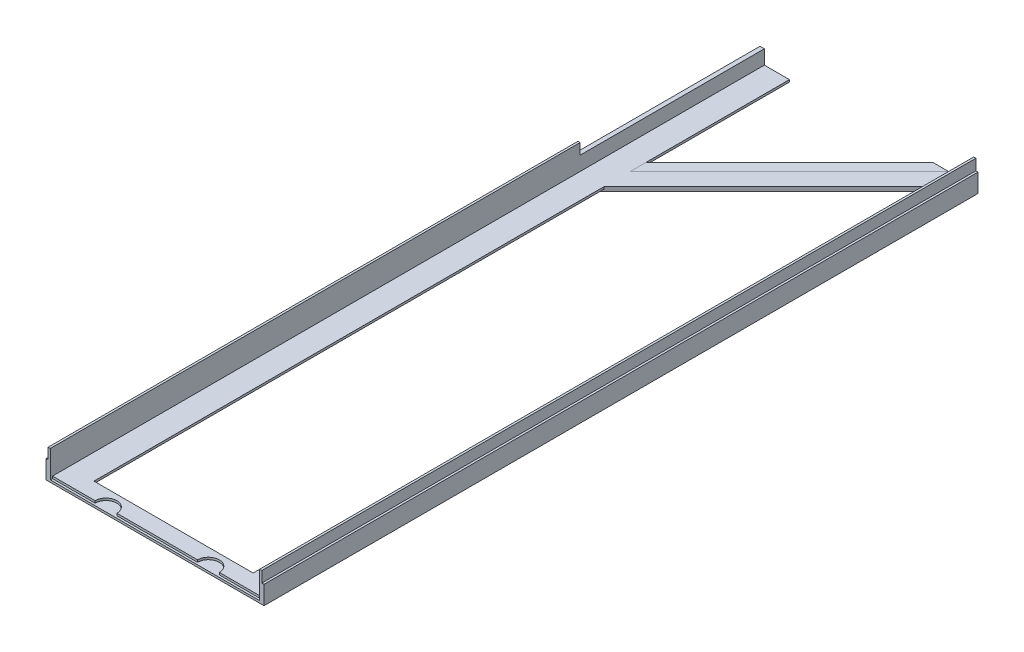
ISO-10303-21;
HEADER;
FILE_DESCRIPTION(('STEP AP214'),'2;1');
FILE_NAME('part.step','',(''),(''),'','','');
FILE_SCHEMA(('AUTOMOTIVE_DESIGN { 1 0 10303 214 1 1 1 1 }'));
ENDSEC;
DATA;
#1=APPLICATION_CONTEXT('core data for automotive mechanical design processes');
#2=APPLICATION_PROTOCOL_DEFINITION('international standard','automotive_design',2000,#1);
#3=PRODUCT_CONTEXT('',#1,'mechanical');
#4=PRODUCT('Part','Part','',(#3));
#5=PRODUCT_RELATED_PRODUCT_CATEGORY('part','',(#4));
#6=PRODUCT_DEFINITION_FORMATION('','',#4);
#7=PRODUCT_DEFINITION_CONTEXT('part definition',#1,'design');
#8=PRODUCT_DEFINITION('design','',#6,#7);
#9=PRODUCT_DEFINITION_SHAPE('','',#8);
#10=(LENGTH_UNIT() NAMED_UNIT(*) SI_UNIT(.MILLI.,.METRE.));
#11=(NAMED_UNIT(*) PLANE_ANGLE_UNIT() SI_UNIT($,.RADIAN.));
#12=(NAMED_UNIT(*) SI_UNIT($,.STERADIAN.) SOLID_ANGLE_UNIT());
#13=UNCERTAINTY_MEASURE_WITH_UNIT(LENGTH_MEASURE(1.E-05),#10,'distance_accuracy_value','');
#14=(GEOMETRIC_REPRESENTATION_CONTEXT(3) GLOBAL_UNCERTAINTY_ASSIGNED_CONTEXT((#13)) GLOBAL_UNIT_ASSIGNED_CONTEXT((#10,
#11,#12)) REPRESENTATION_CONTEXT('',''));
#15=CARTESIAN_POINT('',(0.,0.,0.));
#16=DIRECTION('',(0.,0.,1.));
#17=DIRECTION('',(1.,0.,0.));
#18=AXIS2_PLACEMENT_3D('',#15,#16,#17);
#19=CARTESIAN_POINT('',(13.5,1.,73.0000000000008));
#20=DIRECTION('',(-1.,0.,0.));
#21=DIRECTION('',(0.,-1.,0.));
#22=AXIS2_PLACEMENT_3D('',#19,#20,#21);
#23=PLANE('',#22);
#24=DIRECTION('',(0.,0.,1.));
#25=VECTOR('',#24,1.);
#26=CARTESIAN_POINT('',(13.5,2.,73.0000000000008));
#27=LINE('',#26,#25);
#28=CARTESIAN_POINT('',(13.5,2.,65.9289321881353));
#29=VERTEX_POINT('',#28);
#30=CARTESIAN_POINT('',(13.5,2.,73.0000000000008));
#31=VERTEX_POINT('',#30);
#32=EDGE_CURVE('E153',#29,#31,#27,.T.);
#33=ORIENTED_EDGE('',*,*,#32,.F.);
#34=DIRECTION('',(0.,1.,0.));
#35=VECTOR('',#34,1.);
#36=CARTESIAN_POINT('',(13.5,1.,65.9289321881353));
#37=LINE('',#36,#35);
#38=CARTESIAN_POINT('',(13.5,1.,65.9289321881353));
#39=VERTEX_POINT('',#38);
#40=EDGE_CURVE('E13',#39,#29,#37,.T.);
#41=ORIENTED_EDGE('',*,*,#40,.F.);
#42=DIRECTION('',(0.,0.,1.));
#43=VECTOR('',#42,1.);
#44=CARTESIAN_POINT('',(13.5,1.,73.0000000000008));
#45=LINE('',#44,#43);
#46=CARTESIAN_POINT('',(13.5,1.,73.0000000000008));
#47=VERTEX_POINT('',#46);
#48=EDGE_CURVE('E147',#39,#47,#45,.T.);
#49=ORIENTED_EDGE('',*,*,#48,.T.);
#50=DIRECTION('',(0.,1.,0.));
#51=VECTOR('',#50,1.);
#52=CARTESIAN_POINT('',(13.5,1.,73.0000000000008));
#53=LINE('',#52,#51);
#54=EDGE_CURVE('E92',#47,#31,#53,.T.);
#55=ORIENTED_EDGE('',*,*,#54,.T.);
#56=EDGE_LOOP('',(#33,#41,#49,#55));
#57=FACE_BOUND('',#56,.T.);
#58=ADVANCED_FACE('F89',(#57),#23,.T.);
#59=CARTESIAN_POINT('',(13.5,1.,65.9289321881353));
#60=DIRECTION('',(-0.707106781186552,0.,-0.707106781186544));
#61=DIRECTION('',(-0.707106781186544,0.,0.707106781186552));
#62=AXIS2_PLACEMENT_3D('',#59,#60,#61);
#63=PLANE('',#62);
#64=DIRECTION('',(-0.707106781186544,0.,0.707106781186551));
#65=VECTOR('',#64,1.);
#66=CARTESIAN_POINT('',(13.5,2.,65.9289321881353));
#67=LINE('',#66,#65);
#68=CARTESIAN_POINT('',(79.4289321881346,2.00000000000001,0.));
#69=VERTEX_POINT('',#68);
#70=EDGE_CURVE('E149',#69,#29,#67,.T.);
#71=ORIENTED_EDGE('',*,*,#70,.F.);
#72=DIRECTION('',(0.,1.,0.));
#73=VECTOR('',#72,1.);
#74=CARTESIAN_POINT('',(79.4289321881346,1.00000000000001,0.));
#75=LINE('',#74,#73);
#76=CARTESIAN_POINT('',(79.4289321881346,1.00000000000001,0.));
#77=VERTEX_POINT('',#76);
#78=EDGE_CURVE('E98',#77,#69,#75,.T.);
#79=ORIENTED_EDGE('',*,*,#78,.F.);
#80=DIRECTION('',(-0.707106781186544,0.,0.707106781186551));
#81=VECTOR('',#80,1.);
#82=CARTESIAN_POINT('',(13.5,1.,65.9289321881353));
#83=LINE('',#82,#81);
#84=EDGE_CURVE('E144',#77,#39,#83,.T.);
#85=ORIENTED_EDGE('',*,*,#84,.T.);
#86=ORIENTED_EDGE('',*,*,#40,.T.);
#87=EDGE_LOOP('',(#71,#79,#85,#86));
#88=FACE_BOUND('',#87,.T.);
#89=ADVANCED_FACE('F163',(#88),#63,.T.);
#90=CARTESIAN_POINT('',(79.4289321881346,1.00000000000001,0.));
#91=DIRECTION('',(0.,0.,-1.));
#92=DIRECTION('',(-1.,0.,0.));
#93=AXIS2_PLACEMENT_3D('',#90,#91,#92);
#94=PLANE('',#93);
#95=DIRECTION('',(-1.,0.,0.));
#96=VECTOR('',#95,1.);
#97=CARTESIAN_POINT('',(79.4289321881346,2.00000000000001,0.));
#98=LINE('',#97,#96);
#99=CARTESIAN_POINT('',(86.5,2.00000000000001,0.));
#100=VERTEX_POINT('',#99);
#101=EDGE_CURVE('E139',#100,#69,#98,.T.);
#102=ORIENTED_EDGE('',*,*,#101,.F.);
#103=DIRECTION('',(0.,1.,0.));
#104=VECTOR('',#103,1.);
#105=CARTESIAN_POINT('',(86.5,1.00000000000001,0.));
#106=LINE('',#105,#104);
#107=CARTESIAN_POINT('',(86.5,1.00000000000001,0.));
#108=VERTEX_POINT('',#107);
#109=EDGE_CURVE('E134',#108,#100,#106,.T.);
#110=ORIENTED_EDGE('',*,*,#109,.F.);
#111=DIRECTION('',(-1.,0.,0.));
#112=VECTOR('',#111,1.);
#113=CARTESIAN_POINT('',(79.4289321881346,1.00000000000001,0.));
#114=LINE('',#113,#112);
#115=EDGE_CURVE('E137',#108,#77,#114,.T.);
#116=ORIENTED_EDGE('',*,*,#115,.T.);
#117=ORIENTED_EDGE('',*,*,#78,.T.);
#118=EDGE_LOOP('',(#102,#110,#116,#117));
#119=FACE_BOUND('',#118,.T.);
#120=ADVANCED_FACE('F136',(#119),#94,.T.);
#121=CARTESIAN_POINT('',(86.5,1.00000000000001,0.));
#122=DIRECTION('',(0.707106781186551,0.,0.707106781186544));
#123=DIRECTION('',(0.707106781186544,0.,-0.707106781186551));
#124=AXIS2_PLACEMENT_3D('',#121,#122,#123);
#125=PLANE('',#124);
#126=DIRECTION('',(0.707106781186544,0.,-0.707106781186551));
#127=VECTOR('',#126,1.);
#128=CARTESIAN_POINT('',(86.5,2.00000000000001,0.));
#129=LINE('',#128,#127);
#130=EDGE_CURVE('E156',#31,#100,#129,.T.);
#131=ORIENTED_EDGE('',*,*,#130,.F.);
#132=ORIENTED_EDGE('',*,*,#54,.F.);
#133=DIRECTION('',(0.707106781186544,0.,-0.707106781186551));
#134=VECTOR('',#133,1.);
#135=CARTESIAN_POINT('',(86.5,1.00000000000001,0.));
#136=LINE('',#135,#134);
#137=EDGE_CURVE('E143',#47,#108,#136,.T.);
#138=ORIENTED_EDGE('',*,*,#137,.T.);
#139=ORIENTED_EDGE('',*,*,#109,.T.);
#140=EDGE_LOOP('',(#131,#132,#138,#139));
#141=FACE_BOUND('',#140,.T.);
#142=ADVANCED_FACE('F146',(#141),#125,.T.);
#143=CARTESIAN_POINT('',(0.,1.,0.));
#144=DIRECTION('',(0.,-1.,0.));
#145=DIRECTION('',(1.,0.,0.));
#146=AXIS2_PLACEMENT_3D('',#143,#144,#145);
#147=PLANE('',#146);
#148=ORIENTED_EDGE('',*,*,#48,.F.);
#149=ORIENTED_EDGE('',*,*,#84,.F.);
#150=ORIENTED_EDGE('',*,*,#115,.F.);
#151=ORIENTED_EDGE('',*,*,#137,.F.);
#152=EDGE_LOOP('',(#148,#149,#150,#151));
#153=FACE_BOUND('',#152,.T.);
#154=ADVANCED_FACE('F142',(#153),#147,.T.);
#155=CARTESIAN_POINT('',(0.,2.,0.));
#156=DIRECTION('',(0.,-1.,0.));
#157=DIRECTION('',(1.,0.,0.));
#158=AXIS2_PLACEMENT_3D('',#155,#156,#157);
#159=PLANE('',#158);
#160=ORIENTED_EDGE('',*,*,#32,.T.);
#161=ORIENTED_EDGE('',*,*,#130,.T.);
#162=ORIENTED_EDGE('',*,*,#101,.T.);
#163=ORIENTED_EDGE('',*,*,#70,.T.);
#164=EDGE_LOOP('',(#160,#161,#162,#163));
#165=FACE_BOUND('',#164,.T.);
#166=ADVANCED_FACE('F162',(#165),#159,.F.);
#167=CLOSED_SHELL('',(#58,#89,#120,#142,#154,#166));
#168=MANIFOLD_SOLID_BREP('B2',#167);
#169=CARTESIAN_POINT('',(2.,2.,327.5));
#170=DIRECTION('',(0.,-1.,0.));
#171=DIRECTION('',(1.,0.,0.));
#172=AXIS2_PLACEMENT_3D('',#169,#170,#171);
#173=PLANE('',#172);
#174=DIRECTION('',(1.,0.,0.));
#175=VECTOR('',#174,1.);
#176=CARTESIAN_POINT('',(100.,2.00000000000001,319.));
#177=LINE('',#176,#175);
#178=CARTESIAN_POINT('',(13.5,2.,319.));
#179=VERTEX_POINT('',#178);
#180=CARTESIAN_POINT('',(86.5,2.00000000000001,319.));
#181=VERTEX_POINT('',#180);
#182=EDGE_CURVE('E241',#179,#181,#177,.T.);
#183=ORIENTED_EDGE('',*,*,#182,.F.);
#184=DIRECTION('',(0.,0.,-1.));
#185=VECTOR('',#184,1.);
#186=CARTESIAN_POINT('',(13.5,2.,327.5));
#187=LINE('',#186,#185);
#188=CARTESIAN_POINT('',(13.5,2.,85.0208152801722));
#189=VERTEX_POINT('',#188);
#190=EDGE_CURVE('E461',#179,#189,#187,.T.);
#191=ORIENTED_EDGE('',*,*,#190,.T.);
#192=DIRECTION('',(0.707106781186544,0.,-0.707106781186551));
#193=VECTOR('',#192,1.);
#194=CARTESIAN_POINT('',(13.5,2.,85.0208152801722));
#195=LINE('',#194,#193);
#196=CARTESIAN_POINT('',(86.5,2.00000000000001,12.0208152801714));
#197=VERTEX_POINT('',#196);
#198=EDGE_CURVE('E688',#189,#197,#195,.T.);
#199=ORIENTED_EDGE('',*,*,#198,.T.);
#200=DIRECTION('',(0.,0.,-1.));
#201=VECTOR('',#200,1.);
#202=CARTESIAN_POINT('',(86.5,2.00000000000001,327.5));
#203=LINE('',#202,#201);
#204=EDGE_CURVE('E669',#181,#197,#203,.T.);
#205=ORIENTED_EDGE('',*,*,#204,.F.);
#206=EDGE_LOOP('',(#183,#191,#199,#205));
#207=FACE_BOUND('',#206,.T.);
#208=DIRECTION('',(1.,0.,0.));
#209=VECTOR('',#208,1.);
#210=CARTESIAN_POINT('',(2.,2.,326.5));
#211=LINE('',#210,#209);
#212=CARTESIAN_POINT('',(2.,2.,326.5));
#213=VERTEX_POINT('',#212);
#214=CARTESIAN_POINT('',(21.5,2.,326.5));
#215=VERTEX_POINT('',#214);
#216=EDGE_CURVE('E560',#213,#215,#211,.T.);
#217=ORIENTED_EDGE('',*,*,#216,.T.);
#218=CARTESIAN_POINT('',(26.5,2.,326.5));
#219=DIRECTION('',(0.,1.,0.));
#220=DIRECTION('',(-1.,0.,0.));
#221=AXIS2_PLACEMENT_3D('',#218,#219,#220);
#222=CIRCLE('',#221,5.);
#223=CARTESIAN_POINT('',(31.5,2.,326.5));
#224=VERTEX_POINT('',#223);
#225=EDGE_CURVE('E579',#224,#215,#222,.T.);
#226=ORIENTED_EDGE('',*,*,#225,.F.);
#227=CARTESIAN_POINT('',(68.5,2.00000000000001,326.5));
#228=VERTEX_POINT('',#227);
#229=EDGE_CURVE('E558',#224,#228,#211,.T.);
#230=ORIENTED_EDGE('',*,*,#229,.T.);
#231=CARTESIAN_POINT('',(73.5,2.00000000000001,326.5));
#232=DIRECTION('',(0.,1.,0.));
#233=DIRECTION('',(-1.,0.,0.));
#234=AXIS2_PLACEMENT_3D('',#231,#232,#233);
#235=CIRCLE('',#234,5.00000000000001);
#236=CARTESIAN_POINT('',(78.5,2.00000000000001,326.5));
#237=VERTEX_POINT('',#236);
#238=EDGE_CURVE('E567',#237,#228,#235,.T.);
#239=ORIENTED_EDGE('',*,*,#238,.F.);
#240=CARTESIAN_POINT('',(98.,2.00000000000001,326.5));
#241=VERTEX_POINT('',#240);
#242=EDGE_CURVE('E555',#237,#241,#211,.T.);
#243=ORIENTED_EDGE('',*,*,#242,.T.);
#244=DIRECTION('',(0.,0.,-1.));
#245=VECTOR('',#244,1.);
#246=CARTESIAN_POINT('',(98.,2.00000000000001,327.5));
#247=LINE('',#246,#245);
#248=CARTESIAN_POINT('',(98.,2.00000000000001,0.));
#249=VERTEX_POINT('',#248);
#250=EDGE_CURVE('E671',#241,#249,#247,.T.);
#251=ORIENTED_EDGE('',*,*,#250,.T.);
#252=DIRECTION('',(-1.,0.,0.));
#253=VECTOR('',#252,1.);
#254=CARTESIAN_POINT('',(86.5,2.00000000000001,0.));
#255=LINE('',#254,#253);
#256=CARTESIAN_POINT('',(86.5,2.00000000000001,0.));
#257=VERTEX_POINT('',#256);
#258=EDGE_CURVE('E658',#249,#257,#255,.T.);
#259=ORIENTED_EDGE('',*,*,#258,.T.);
#260=DIRECTION('',(-0.707106781186544,0.,0.707106781186551));
#261=VECTOR('',#260,1.);
#262=CARTESIAN_POINT('',(86.5,2.00000000000001,0.));
#263=LINE('',#262,#261);
#264=CARTESIAN_POINT('',(13.5,2.,73.0000000000008));
#265=VERTEX_POINT('',#264);
#266=EDGE_CURVE('E685',#257,#265,#263,.T.);
#267=ORIENTED_EDGE('',*,*,#266,.T.);
#268=CARTESIAN_POINT('',(13.5,2.,0.));
#269=VERTEX_POINT('',#268);
#270=EDGE_CURVE('E460',#265,#269,#187,.T.);
#271=ORIENTED_EDGE('',*,*,#270,.T.);
#272=DIRECTION('',(-1.,0.,0.));
#273=VECTOR('',#272,1.);
#274=CARTESIAN_POINT('',(2.,2.,0.));
#275=LINE('',#274,#273);
#276=CARTESIAN_POINT('',(2.,2.,0.));
#277=VERTEX_POINT('',#276);
#278=EDGE_CURVE('E516',#269,#277,#275,.T.);
#279=ORIENTED_EDGE('',*,*,#278,.T.);
#280=DIRECTION('',(0.,0.,-1.));
#281=VECTOR('',#280,1.);
#282=CARTESIAN_POINT('',(2.,2.,327.5));
#283=LINE('',#282,#281);
#284=EDGE_CURVE('E453',#213,#277,#283,.T.);
#285=ORIENTED_EDGE('',*,*,#284,.F.);
#286=EDGE_LOOP('',(#217,#226,#230,#239,#243,#251,#259,#267,#271,#279,#285));
#287=FACE_BOUND('',#286,.T.);
#288=ADVANCED_FACE('F218',(#207,#287),#173,.F.);
#289=CARTESIAN_POINT('',(0.,0.,327.5));
#290=DIRECTION('',(0.,0.,-1.));
#291=DIRECTION('',(-1.,0.,0.));
#292=AXIS2_PLACEMENT_3D('',#289,#290,#291);
#293=PLANE('',#292);
#294=DIRECTION('',(1.,0.,0.));
#295=VECTOR('',#294,1.);
#296=CARTESIAN_POINT('',(0.,1.,327.5));
#297=LINE('',#296,#295);
#298=CARTESIAN_POINT('',(2.,1.,327.5));
#299=VERTEX_POINT('',#298);
#300=CARTESIAN_POINT('',(98.,1.00000000000001,327.5));
#301=VERTEX_POINT('',#300);
#302=EDGE_CURVE('E87',#299,#301,#297,.T.);
#303=ORIENTED_EDGE('',*,*,#302,.F.);
#304=DIRECTION('',(0.,1.,0.));
#305=VECTOR('',#304,1.);
#306=CARTESIAN_POINT('',(2.,13.5,327.5));
#307=LINE('',#306,#305);
#308=CARTESIAN_POINT('',(2.,13.5,327.5));
#309=VERTEX_POINT('',#308);
#310=EDGE_CURVE('E493',#299,#309,#307,.T.);
#311=ORIENTED_EDGE('',*,*,#310,.T.);
#312=DIRECTION('',(-1.,0.,0.));
#313=VECTOR('',#312,1.);
#314=CARTESIAN_POINT('',(1.,13.5,327.5));
#315=LINE('',#314,#313);
#316=CARTESIAN_POINT('',(1.,13.5,327.5));
#317=VERTEX_POINT('',#316);
#318=EDGE_CURVE('E496',#309,#317,#315,.T.);
#319=ORIENTED_EDGE('',*,*,#318,.T.);
#320=DIRECTION('',(0.,-1.,0.));
#321=VECTOR('',#320,1.);
#322=CARTESIAN_POINT('',(1.,8.5,327.5));
#323=LINE('',#322,#321);
#324=CARTESIAN_POINT('',(1.,8.5,327.5));
#325=VERTEX_POINT('',#324);
#326=EDGE_CURVE('E450',#317,#325,#323,.T.);
#327=ORIENTED_EDGE('',*,*,#326,.T.);
#328=DIRECTION('',(-1.,0.,0.));
#329=VECTOR('',#328,1.);
#330=CARTESIAN_POINT('',(0.,8.5,327.5));
#331=LINE('',#330,#329);
#332=CARTESIAN_POINT('',(0.,8.5,327.5));
#333=VERTEX_POINT('',#332);
#334=EDGE_CURVE('E499',#325,#333,#331,.T.);
#335=ORIENTED_EDGE('',*,*,#334,.T.);
#336=DIRECTION('',(0.,-1.,0.));
#337=VECTOR('',#336,1.);
#338=CARTESIAN_POINT('',(0.,0.,327.5));
#339=LINE('',#338,#337);
#340=CARTESIAN_POINT('',(0.,0.,327.5));
#341=VERTEX_POINT('',#340);
#342=EDGE_CURVE('E501',#333,#341,#339,.T.);
#343=ORIENTED_EDGE('',*,*,#342,.T.);
#344=DIRECTION('',(1.,0.,0.));
#345=VECTOR('',#344,1.);
#346=CARTESIAN_POINT('',(8.5,0.,327.5));
#347=LINE('',#346,#345);
#348=CARTESIAN_POINT('',(100.,0.,327.5));
#349=VERTEX_POINT('',#348);
#350=EDGE_CURVE('E491',#341,#349,#347,.T.);
#351=ORIENTED_EDGE('',*,*,#350,.T.);
#352=DIRECTION('',(0.,1.,0.));
#353=VECTOR('',#352,1.);
#354=CARTESIAN_POINT('',(100.,8.50000000000001,327.5));
#355=LINE('',#354,#353);
#356=CARTESIAN_POINT('',(100.,8.50000000000001,327.5));
#357=VERTEX_POINT('',#356);
#358=EDGE_CURVE('E547',#349,#357,#355,.T.);
#359=ORIENTED_EDGE('',*,*,#358,.T.);
#360=DIRECTION('',(-1.,0.,0.));
#361=VECTOR('',#360,1.);
#362=CARTESIAN_POINT('',(99.,8.50000000000001,327.5));
#363=LINE('',#362,#361);
#364=CARTESIAN_POINT('',(99.,8.50000000000001,327.5));
#365=VERTEX_POINT('',#364);
#366=EDGE_CURVE('E637',#357,#365,#363,.T.);
#367=ORIENTED_EDGE('',*,*,#366,.T.);
#368=DIRECTION('',(0.,1.,0.));
#369=VECTOR('',#368,1.);
#370=CARTESIAN_POINT('',(99.,13.5,327.5));
#371=LINE('',#370,#369);
#372=CARTESIAN_POINT('',(99.,13.5,327.5));
#373=VERTEX_POINT('',#372);
#374=EDGE_CURVE('E640',#365,#373,#371,.T.);
#375=ORIENTED_EDGE('',*,*,#374,.T.);
#376=DIRECTION('',(-1.,0.,0.));
#377=VECTOR('',#376,1.);
#378=CARTESIAN_POINT('',(98.,13.5,327.5));
#379=LINE('',#378,#377);
#380=CARTESIAN_POINT('',(98.,13.5,327.5));
#381=VERTEX_POINT('',#380);
#382=EDGE_CURVE('E642',#373,#381,#379,.T.);
#383=ORIENTED_EDGE('',*,*,#382,.T.);
#384=DIRECTION('',(0.,-1.,0.));
#385=VECTOR('',#384,1.);
#386=CARTESIAN_POINT('',(98.,2.00000000000001,327.5));
#387=LINE('',#386,#385);
#388=EDGE_CURVE('E644',#381,#301,#387,.T.);
#389=ORIENTED_EDGE('',*,*,#388,.T.);
#390=EDGE_LOOP('',(#303,#311,#319,#327,#335,#343,#351,#359,#367,#375,#383,#389));
#391=FACE_BOUND('',#390,.T.);
#392=ADVANCED_FACE('F546',(#391),#293,.F.);
#393=CARTESIAN_POINT('',(8.5,1.,327.5));
#394=DIRECTION('',(-1.,0.,0.));
#395=DIRECTION('',(0.,0.,1.));
#396=AXIS2_PLACEMENT_3D('',#393,#394,#395);
#397=PLANE('',#396);
#398=DIRECTION('',(0.,0.,-1.));
#399=VECTOR('',#398,1.);
#400=CARTESIAN_POINT('',(8.5,1.,327.5));
#401=LINE('',#400,#399);
#402=CARTESIAN_POINT('',(8.5,1.,319.));
#403=VERTEX_POINT('',#402);
#404=CARTESIAN_POINT('',(8.5,1.,90.0208152801721));
#405=VERTEX_POINT('',#404);
#406=EDGE_CURVE('E467',#403,#405,#401,.T.);
#407=ORIENTED_EDGE('',*,*,#406,.F.);
#408=DIRECTION('',(0.,-1.,0.));
#409=VECTOR('',#408,1.);
#410=CARTESIAN_POINT('',(8.5,1.,319.));
#411=LINE('',#410,#409);
#412=CARTESIAN_POINT('',(8.50000000000001,0.,319.));
#413=VERTEX_POINT('',#412);
#414=EDGE_CURVE('E615',#403,#413,#411,.T.);
#415=ORIENTED_EDGE('',*,*,#414,.T.);
#416=DIRECTION('',(0.,0.,-1.));
#417=VECTOR('',#416,1.);
#418=CARTESIAN_POINT('',(8.5,0.,327.5));
#419=LINE('',#418,#417);
#420=CARTESIAN_POINT('',(8.5,0.,90.0208152801721));
#421=VERTEX_POINT('',#420);
#422=EDGE_CURVE('E470',#413,#421,#419,.T.);
#423=ORIENTED_EDGE('',*,*,#422,.T.);
#424=DIRECTION('',(0.,1.,0.));
#425=VECTOR('',#424,1.);
#426=CARTESIAN_POINT('',(8.5,0.,90.0208152801721));
#427=LINE('',#426,#425);
#428=EDGE_CURVE('E632',#421,#405,#427,.T.);
#429=ORIENTED_EDGE('',*,*,#428,.T.);
#430=EDGE_LOOP('',(#407,#415,#423,#429));
#431=FACE_BOUND('',#430,.T.);
#432=ADVANCED_FACE('F713',(#431),#397,.F.);
#433=CARTESIAN_POINT('',(13.5,1.,327.5));
#434=DIRECTION('',(0.,1.,0.));
#435=DIRECTION('',(-1.,0.,0.));
#436=AXIS2_PLACEMENT_3D('',#433,#434,#435);
#437=PLANE('',#436);
#438=DIRECTION('',(0.,0.,-1.));
#439=VECTOR('',#438,1.);
#440=CARTESIAN_POINT('',(13.5,1.,327.5));
#441=LINE('',#440,#439);
#442=CARTESIAN_POINT('',(13.5,1.,319.));
#443=VERTEX_POINT('',#442);
#444=CARTESIAN_POINT('',(13.5,1.,85.0208152801722));
#445=VERTEX_POINT('',#444);
#446=EDGE_CURVE('E464',#443,#445,#441,.T.);
#447=ORIENTED_EDGE('',*,*,#446,.F.);
#448=DIRECTION('',(-1.,0.,0.));
#449=VECTOR('',#448,1.);
#450=CARTESIAN_POINT('',(13.5,1.,319.));
#451=LINE('',#450,#449);
#452=EDGE_CURVE('E612',#443,#403,#451,.T.);
#453=ORIENTED_EDGE('',*,*,#452,.T.);
#454=ORIENTED_EDGE('',*,*,#406,.T.);
#455=DIRECTION('',(-0.707106781186549,0.,0.707106781186546));
#456=VECTOR('',#455,1.);
#457=CARTESIAN_POINT('',(49.260407640086,1.00000000000001,49.2604076400863));
#458=LINE('',#457,#456);
#459=EDGE_CURVE('E626',#445,#405,#458,.T.);
#460=ORIENTED_EDGE('',*,*,#459,.F.);
#461=EDGE_LOOP('',(#447,#453,#454,#460));
#462=FACE_BOUND('',#461,.T.);
#463=ADVANCED_FACE('F710',(#462),#437,.F.);
#464=CARTESIAN_POINT('',(13.5,2.,327.5));
#465=DIRECTION('',(-1.,0.,0.));
#466=DIRECTION('',(0.,0.,1.));
#467=AXIS2_PLACEMENT_3D('',#464,#465,#466);
#468=PLANE('',#467);
#469=DIRECTION('',(0.,1.,0.));
#470=VECTOR('',#469,1.);
#471=CARTESIAN_POINT('',(13.5,0.,73.0000000000008));
#472=LINE('',#471,#470);
#473=CARTESIAN_POINT('',(13.5,1.,73.0000000000008));
#474=VERTEX_POINT('',#473);
#475=EDGE_CURVE('E473',#474,#265,#472,.T.);
#476=ORIENTED_EDGE('',*,*,#475,.F.);
#477=CARTESIAN_POINT('',(13.5,1.,0.));
#478=VERTEX_POINT('',#477);
#479=EDGE_CURVE('E463',#474,#478,#441,.T.);
#480=ORIENTED_EDGE('',*,*,#479,.T.);
#481=DIRECTION('',(0.,1.,0.));
#482=VECTOR('',#481,1.);
#483=CARTESIAN_POINT('',(13.5,2.,0.));
#484=LINE('',#483,#482);
#485=EDGE_CURVE('E513',#478,#269,#484,.T.);
#486=ORIENTED_EDGE('',*,*,#485,.T.);
#487=ORIENTED_EDGE('',*,*,#270,.F.);
#488=EDGE_LOOP('',(#476,#480,#486,#487));
#489=FACE_BOUND('',#488,.T.);
#490=ADVANCED_FACE('F750',(#489),#468,.F.);
#491=CARTESIAN_POINT('',(8.5,0.,327.5));
#492=DIRECTION('',(0.,1.,0.));
#493=DIRECTION('',(-1.,0.,0.));
#494=AXIS2_PLACEMENT_3D('',#491,#492,#493);
#495=PLANE('',#494);
#496=ORIENTED_EDGE('',*,*,#422,.F.);
#497=DIRECTION('',(1.,0.,0.));
#498=VECTOR('',#497,1.);
#499=CARTESIAN_POINT('',(100.,0.,319.));
#500=LINE('',#499,#498);
#501=CARTESIAN_POINT('',(91.5,0.,319.));
#502=VERTEX_POINT('',#501);
#503=EDGE_CURVE('E573',#413,#502,#500,.T.);
#504=ORIENTED_EDGE('',*,*,#503,.T.);
#505=DIRECTION('',(0.,0.,-1.));
#506=VECTOR('',#505,1.);
#507=CARTESIAN_POINT('',(91.5,0.,327.5));
#508=LINE('',#507,#506);
#509=CARTESIAN_POINT('',(91.5,0.,7.02081528017151));
#510=VERTEX_POINT('',#509);
#511=EDGE_CURVE('E663',#502,#510,#508,.T.);
#512=ORIENTED_EDGE('',*,*,#511,.T.);
#513=DIRECTION('',(0.707106781186544,0.,-0.707106781186551));
#514=VECTOR('',#513,1.);
#515=CARTESIAN_POINT('',(13.5,0.,85.0208152801722));
#516=LINE('',#515,#514);
#517=EDGE_CURVE('E490',#421,#510,#516,.T.);
#518=ORIENTED_EDGE('',*,*,#517,.F.);
#519=EDGE_LOOP('',(#496,#504,#512,#518));
#520=FACE_BOUND('',#519,.T.);
#521=DIRECTION('',(1.,0.,0.));
#522=VECTOR('',#521,1.);
#523=CARTESIAN_POINT('',(100.,0.,0.));
#524=LINE('',#523,#522);
#525=CARTESIAN_POINT('',(86.5,0.,0.));
#526=VERTEX_POINT('',#525);
#527=CARTESIAN_POINT('',(100.,0.,0.));
#528=VERTEX_POINT('',#527);
#529=EDGE_CURVE('E638',#526,#528,#524,.T.);
#530=ORIENTED_EDGE('',*,*,#529,.T.);
#531=DIRECTION('',(0.,0.,-1.));
#532=VECTOR('',#531,1.);
#533=CARTESIAN_POINT('',(100.,0.,327.5));
#534=LINE('',#533,#532);
#535=EDGE_CURVE('E543',#349,#528,#534,.T.);
#536=ORIENTED_EDGE('',*,*,#535,.F.);
#537=ORIENTED_EDGE('',*,*,#350,.F.);
#538=DIRECTION('',(0.,0.,-1.));
#539=VECTOR('',#538,1.);
#540=CARTESIAN_POINT('',(0.,0.,327.5));
#541=LINE('',#540,#539);
#542=CARTESIAN_POINT('',(0.,0.,0.));
#543=VERTEX_POINT('',#542);
#544=EDGE_CURVE('E503',#341,#543,#541,.T.);
#545=ORIENTED_EDGE('',*,*,#544,.T.);
#546=DIRECTION('',(1.,0.,0.));
#547=VECTOR('',#546,1.);
#548=CARTESIAN_POINT('',(8.5,0.,0.));
#549=LINE('',#548,#547);
#550=CARTESIAN_POINT('',(8.5,0.,0.));
#551=VERTEX_POINT('',#550);
#552=EDGE_CURVE('E504',#543,#551,#549,.T.);
#553=ORIENTED_EDGE('',*,*,#552,.T.);
#554=CARTESIAN_POINT('',(8.5,0.,78.0000000000007));
#555=VERTEX_POINT('',#554);
#556=EDGE_CURVE('E469',#555,#551,#419,.T.);
#557=ORIENTED_EDGE('',*,*,#556,.F.);
#558=DIRECTION('',(-0.707106781186544,0.,0.707106781186551));
#559=VECTOR('',#558,1.);
#560=CARTESIAN_POINT('',(86.5,0.,0.));
#561=LINE('',#560,#559);
#562=EDGE_CURVE('E686',#526,#555,#561,.T.);
#563=ORIENTED_EDGE('',*,*,#562,.F.);
#564=EDGE_LOOP('',(#530,#536,#537,#545,#553,#557,#563));
#565=FACE_BOUND('',#564,.T.);
#566=ADVANCED_FACE('F220',(#520,#565),#495,.F.);
#567=CARTESIAN_POINT('',(8.5,1.,78.0000000000007));
#568=VERTEX_POINT('',#567);
#569=CARTESIAN_POINT('',(8.5,1.,0.));
#570=VERTEX_POINT('',#569);
#571=EDGE_CURVE('E466',#568,#570,#401,.T.);
#572=ORIENTED_EDGE('',*,*,#571,.F.);
#573=DIRECTION('',(0.,1.,0.));
#574=VECTOR('',#573,1.);
#575=CARTESIAN_POINT('',(8.5,0.,78.0000000000007));
#576=LINE('',#575,#574);
#577=EDGE_CURVE('E629',#555,#568,#576,.T.);
#578=ORIENTED_EDGE('',*,*,#577,.F.);
#579=ORIENTED_EDGE('',*,*,#556,.T.);
#580=DIRECTION('',(0.,1.,0.));
#581=VECTOR('',#580,1.);
#582=CARTESIAN_POINT('',(8.5,1.,0.));
#583=LINE('',#582,#581);
#584=EDGE_CURVE('E507',#551,#570,#583,.T.);
#585=ORIENTED_EDGE('',*,*,#584,.T.);
#586=EDGE_LOOP('',(#572,#578,#579,#585));
#587=FACE_BOUND('',#586,.T.);
#588=ADVANCED_FACE('F752',(#587),#397,.F.);
#589=ORIENTED_EDGE('',*,*,#479,.F.);
#590=DIRECTION('',(-0.707106781186551,0.,0.707106781186544));
#591=VECTOR('',#590,1.);
#592=CARTESIAN_POINT('',(43.2500000000003,1.,43.2500000000008));
#593=LINE('',#592,#591);
#594=EDGE_CURVE('E624',#474,#568,#593,.T.);
#595=ORIENTED_EDGE('',*,*,#594,.T.);
#596=ORIENTED_EDGE('',*,*,#571,.T.);
#597=DIRECTION('',(1.,0.,0.));
#598=VECTOR('',#597,1.);
#599=CARTESIAN_POINT('',(13.5,1.,0.));
#600=LINE('',#599,#598);
#601=EDGE_CURVE('E510',#570,#478,#600,.T.);
#602=ORIENTED_EDGE('',*,*,#601,.T.);
#603=EDGE_LOOP('',(#589,#595,#596,#602));
#604=FACE_BOUND('',#603,.T.);
#605=ADVANCED_FACE('F749',(#604),#437,.F.);
#606=ORIENTED_EDGE('',*,*,#190,.F.);
#607=DIRECTION('',(0.,-1.,0.));
#608=VECTOR('',#607,1.);
#609=CARTESIAN_POINT('',(13.5,2.,319.));
#610=LINE('',#609,#608);
#611=EDGE_CURVE('E609',#179,#443,#610,.T.);
#612=ORIENTED_EDGE('',*,*,#611,.T.);
#613=ORIENTED_EDGE('',*,*,#446,.T.);
#614=DIRECTION('',(0.,1.,0.));
#615=VECTOR('',#614,1.);
#616=CARTESIAN_POINT('',(13.5,0.,85.0208152801722));
#617=LINE('',#616,#615);
#618=EDGE_CURVE('E471',#445,#189,#617,.T.);
#619=ORIENTED_EDGE('',*,*,#618,.T.);
#620=EDGE_LOOP('',(#606,#612,#613,#619));
#621=FACE_BOUND('',#620,.T.);
#622=ADVANCED_FACE('F705',(#621),#468,.F.);
#623=CARTESIAN_POINT('',(2.,13.5,327.5));
#624=DIRECTION('',(-1.,0.,0.));
#625=DIRECTION('',(0.,-1.,0.));
#626=AXIS2_PLACEMENT_3D('',#623,#624,#625);
#627=PLANE('',#626);
#628=DIRECTION('',(0.,1.,0.));
#629=VECTOR('',#628,1.);
#630=CARTESIAN_POINT('',(2.,13.5,0.));
#631=LINE('',#630,#629);
#632=CARTESIAN_POINT('',(2.,8.5,0.));
#633=VERTEX_POINT('',#632);
#634=EDGE_CURVE('E519',#277,#633,#631,.T.);
#635=ORIENTED_EDGE('',*,*,#634,.T.);
#636=DIRECTION('',(0.,0.,-1.));
#637=VECTOR('',#636,1.);
#638=CARTESIAN_POINT('',(2.,8.5,84.5));
#639=LINE('',#638,#637);
#640=CARTESIAN_POINT('',(2.,8.5,84.5));
#641=VERTEX_POINT('',#640);
#642=EDGE_CURVE('E551',#641,#633,#639,.T.);
#643=ORIENTED_EDGE('',*,*,#642,.F.);
#644=DIRECTION('',(0.,-1.,0.));
#645=VECTOR('',#644,1.);
#646=CARTESIAN_POINT('',(2.,13.5,84.5));
#647=LINE('',#646,#645);
#648=CARTESIAN_POINT('',(2.,13.5,84.5));
#649=VERTEX_POINT('',#648);
#650=EDGE_CURVE('E447',#649,#641,#647,.T.);
#651=ORIENTED_EDGE('',*,*,#650,.F.);
#652=DIRECTION('',(0.,0.,-1.));
#653=VECTOR('',#652,1.);
#654=CARTESIAN_POINT('',(2.,13.5,327.5));
#655=LINE('',#654,#653);
#656=EDGE_CURVE('E446',#309,#649,#655,.T.);
#657=ORIENTED_EDGE('',*,*,#656,.F.);
#658=ORIENTED_EDGE('',*,*,#310,.F.);
#659=DIRECTION('',(0.,0.,-1.));
#660=VECTOR('',#659,1.);
#661=CARTESIAN_POINT('',(2.,1.,327.5));
#662=LINE('',#661,#660);
#663=CARTESIAN_POINT('',(2.,1.,326.5));
#664=VERTEX_POINT('',#663);
#665=EDGE_CURVE('E583',#299,#664,#662,.T.);
#666=ORIENTED_EDGE('',*,*,#665,.T.);
#667=DIRECTION('',(0.,1.,0.));
#668=VECTOR('',#667,1.);
#669=CARTESIAN_POINT('',(2.,1.,326.5));
#670=LINE('',#669,#668);
#671=EDGE_CURVE('E582',#664,#213,#670,.T.);
#672=ORIENTED_EDGE('',*,*,#671,.T.);
#673=ORIENTED_EDGE('',*,*,#284,.T.);
#674=EDGE_LOOP('',(#635,#643,#651,#657,#658,#666,#672,#673));
#675=FACE_BOUND('',#674,.T.);
#676=ADVANCED_FACE('F554',(#675),#627,.F.);
#677=CARTESIAN_POINT('',(1.,13.5,327.5));
#678=DIRECTION('',(0.,-1.,0.));
#679=DIRECTION('',(0.,0.,-1.));
#680=AXIS2_PLACEMENT_3D('',#677,#678,#679);
#681=PLANE('',#680);
#682=ORIENTED_EDGE('',*,*,#656,.T.);
#683=DIRECTION('',(1.,0.,0.));
#684=VECTOR('',#683,1.);
#685=CARTESIAN_POINT('',(1.,13.5,84.5));
#686=LINE('',#685,#684);
#687=CARTESIAN_POINT('',(1.,13.5,84.5));
#688=VERTEX_POINT('',#687);
#689=EDGE_CURVE('E429',#688,#649,#686,.T.);
#690=ORIENTED_EDGE('',*,*,#689,.F.);
#691=DIRECTION('',(0.,0.,-1.));
#692=VECTOR('',#691,1.);
#693=CARTESIAN_POINT('',(1.,13.5,327.5));
#694=LINE('',#693,#692);
#695=EDGE_CURVE('E443',#317,#688,#694,.T.);
#696=ORIENTED_EDGE('',*,*,#695,.F.);
#697=ORIENTED_EDGE('',*,*,#318,.F.);
#698=EDGE_LOOP('',(#682,#690,#696,#697));
#699=FACE_BOUND('',#698,.T.);
#700=ADVANCED_FACE('F441',(#699),#681,.F.);
#701=CARTESIAN_POINT('',(1.,8.5,327.5));
#702=DIRECTION('',(1.,0.,0.));
#703=DIRECTION('',(0.,0.,-1.));
#704=AXIS2_PLACEMENT_3D('',#701,#702,#703);
#705=PLANE('',#704);
#706=ORIENTED_EDGE('',*,*,#695,.T.);
#707=DIRECTION('',(0.,1.,0.));
#708=VECTOR('',#707,1.);
#709=CARTESIAN_POINT('',(1.,13.5,84.5));
#710=LINE('',#709,#708);
#711=CARTESIAN_POINT('',(1.,8.5,84.5));
#712=VERTEX_POINT('',#711);
#713=EDGE_CURVE('E426',#712,#688,#710,.T.);
#714=ORIENTED_EDGE('',*,*,#713,.F.);
#715=DIRECTION('',(0.,0.,-1.));
#716=VECTOR('',#715,1.);
#717=CARTESIAN_POINT('',(1.,8.5,327.5));
#718=LINE('',#717,#716);
#719=EDGE_CURVE('E451',#325,#712,#718,.T.);
#720=ORIENTED_EDGE('',*,*,#719,.F.);
#721=ORIENTED_EDGE('',*,*,#326,.F.);
#722=EDGE_LOOP('',(#706,#714,#720,#721));
#723=FACE_BOUND('',#722,.T.);
#724=ADVANCED_FACE('F449',(#723),#705,.F.);
#725=CARTESIAN_POINT('',(0.,8.5,327.5));
#726=DIRECTION('',(0.,-1.,0.));
#727=DIRECTION('',(0.,0.,-1.));
#728=AXIS2_PLACEMENT_3D('',#725,#726,#727);
#729=PLANE('',#728);
#730=DIRECTION('',(-1.,0.,0.));
#731=VECTOR('',#730,1.);
#732=CARTESIAN_POINT('',(0.,8.5,0.));
#733=LINE('',#732,#731);
#734=CARTESIAN_POINT('',(0.,8.5,0.));
#735=VERTEX_POINT('',#734);
#736=EDGE_CURVE('E233',#633,#735,#733,.T.);
#737=ORIENTED_EDGE('',*,*,#736,.T.);
#738=DIRECTION('',(0.,0.,-1.));
#739=VECTOR('',#738,1.);
#740=CARTESIAN_POINT('',(0.,8.5,327.5));
#741=LINE('',#740,#739);
#742=EDGE_CURVE('E455',#333,#735,#741,.T.);
#743=ORIENTED_EDGE('',*,*,#742,.F.);
#744=ORIENTED_EDGE('',*,*,#334,.F.);
#745=ORIENTED_EDGE('',*,*,#719,.T.);
#746=DIRECTION('',(-1.,0.,0.));
#747=VECTOR('',#746,1.);
#748=CARTESIAN_POINT('',(1.,8.5,84.5));
#749=LINE('',#748,#747);
#750=EDGE_CURVE('E432',#641,#712,#749,.T.);
#751=ORIENTED_EDGE('',*,*,#750,.F.);
#752=ORIENTED_EDGE('',*,*,#642,.T.);
#753=EDGE_LOOP('',(#737,#743,#744,#745,#751,#752));
#754=FACE_BOUND('',#753,.T.);
#755=ADVANCED_FACE('F549',(#754),#729,.F.);
#756=CARTESIAN_POINT('',(0.,0.,327.5));
#757=DIRECTION('',(1.,0.,0.));
#758=DIRECTION('',(0.,0.,-1.));
#759=AXIS2_PLACEMENT_3D('',#756,#757,#758);
#760=PLANE('',#759);
#761=DIRECTION('',(0.,-1.,0.));
#762=VECTOR('',#761,1.);
#763=CARTESIAN_POINT('',(0.,0.,0.));
#764=LINE('',#763,#762);
#765=EDGE_CURVE('E494',#735,#543,#764,.T.);
#766=ORIENTED_EDGE('',*,*,#765,.T.);
#767=ORIENTED_EDGE('',*,*,#544,.F.);
#768=ORIENTED_EDGE('',*,*,#342,.F.);
#769=ORIENTED_EDGE('',*,*,#742,.T.);
#770=EDGE_LOOP('',(#766,#767,#768,#769));
#771=FACE_BOUND('',#770,.T.);
#772=ADVANCED_FACE('F529',(#771),#760,.F.);
#773=CARTESIAN_POINT('',(0.,0.,0.));
#774=DIRECTION('',(0.,0.,-1.));
#775=DIRECTION('',(-1.,0.,0.));
#776=AXIS2_PLACEMENT_3D('',#773,#774,#775);
#777=PLANE('',#776);
#778=ORIENTED_EDGE('',*,*,#736,.F.);
#779=ORIENTED_EDGE('',*,*,#634,.F.);
#780=ORIENTED_EDGE('',*,*,#278,.F.);
#781=ORIENTED_EDGE('',*,*,#485,.F.);
#782=ORIENTED_EDGE('',*,*,#601,.F.);
#783=ORIENTED_EDGE('',*,*,#584,.F.);
#784=ORIENTED_EDGE('',*,*,#552,.F.);
#785=ORIENTED_EDGE('',*,*,#765,.F.);
#786=EDGE_LOOP('',(#778,#779,#780,#781,#782,#783,#784,#785));
#787=FACE_BOUND('',#786,.T.);
#788=ADVANCED_FACE('F534',(#787),#777,.T.);
#789=CARTESIAN_POINT('',(13.5,0.,85.0208152801722));
#790=DIRECTION('',(0.707106781186551,0.,0.707106781186544));
#791=DIRECTION('',(0.707106781186544,0.,-0.707106781186551));
#792=AXIS2_PLACEMENT_3D('',#789,#790,#791);
#793=PLANE('',#792);
#794=ORIENTED_EDGE('',*,*,#198,.F.);
#795=ORIENTED_EDGE('',*,*,#618,.F.);
#796=ORIENTED_EDGE('',*,*,#459,.T.);
#797=ORIENTED_EDGE('',*,*,#428,.F.);
#798=ORIENTED_EDGE('',*,*,#517,.T.);
#799=DIRECTION('',(0.,1.,0.));
#800=VECTOR('',#799,1.);
#801=CARTESIAN_POINT('',(91.5,0.,7.02081528017151));
#802=LINE('',#801,#800);
#803=CARTESIAN_POINT('',(91.5,1.00000000000001,7.02081528017151));
#804=VERTEX_POINT('',#803);
#805=EDGE_CURVE('E618',#510,#804,#802,.T.);
#806=ORIENTED_EDGE('',*,*,#805,.T.);
#807=DIRECTION('',(0.707106781186555,0.,-0.70710678118654));
#808=VECTOR('',#807,1.);
#809=CARTESIAN_POINT('',(49.2604076400848,1.00000000000001,49.2604076400858));
#810=LINE('',#809,#808);
#811=CARTESIAN_POINT('',(86.5,1.00000000000001,12.0208152801714));
#812=VERTEX_POINT('',#811);
#813=EDGE_CURVE('E621',#812,#804,#810,.T.);
#814=ORIENTED_EDGE('',*,*,#813,.F.);
#815=DIRECTION('',(0.,1.,0.));
#816=VECTOR('',#815,1.);
#817=CARTESIAN_POINT('',(86.5,0.,12.0208152801714));
#818=LINE('',#817,#816);
#819=EDGE_CURVE('E489',#812,#197,#818,.T.);
#820=ORIENTED_EDGE('',*,*,#819,.T.);
#821=EDGE_LOOP('',(#794,#795,#796,#797,#798,#806,#814,#820));
#822=FACE_BOUND('',#821,.T.);
#823=ADVANCED_FACE('F698',(#822),#793,.T.);
#824=CARTESIAN_POINT('',(86.5,0.,0.));
#825=DIRECTION('',(-0.707106781186551,0.,-0.707106781186544));
#826=DIRECTION('',(-0.707106781186544,0.,0.707106781186551));
#827=AXIS2_PLACEMENT_3D('',#824,#825,#826);
#828=PLANE('',#827);
#829=ORIENTED_EDGE('',*,*,#266,.F.);
#830=DIRECTION('',(0.,1.,0.));
#831=VECTOR('',#830,1.);
#832=CARTESIAN_POINT('',(86.5,0.,0.));
#833=LINE('',#832,#831);
#834=EDGE_CURVE('E487',#526,#257,#833,.T.);
#835=ORIENTED_EDGE('',*,*,#834,.F.);
#836=ORIENTED_EDGE('',*,*,#562,.T.);
#837=ORIENTED_EDGE('',*,*,#577,.T.);
#838=ORIENTED_EDGE('',*,*,#594,.F.);
#839=ORIENTED_EDGE('',*,*,#475,.T.);
#840=EDGE_LOOP('',(#829,#835,#836,#837,#838,#839));
#841=FACE_BOUND('',#840,.T.);
#842=ADVANCED_FACE('F773',(#841),#828,.T.);
#843=CARTESIAN_POINT('',(100.,8.50000000000001,327.5));
#844=DIRECTION('',(-1.,0.,0.));
#845=DIRECTION('',(0.,0.,1.));
#846=AXIS2_PLACEMENT_3D('',#843,#844,#845);
#847=PLANE('',#846);
#848=ORIENTED_EDGE('',*,*,#535,.T.);
#849=DIRECTION('',(0.,1.,0.));
#850=VECTOR('',#849,1.);
#851=CARTESIAN_POINT('',(100.,8.50000000000001,0.));
#852=LINE('',#851,#850);
#853=CARTESIAN_POINT('',(100.,8.50000000000001,0.));
#854=VERTEX_POINT('',#853);
#855=EDGE_CURVE('E635',#528,#854,#852,.T.);
#856=ORIENTED_EDGE('',*,*,#855,.T.);
#857=DIRECTION('',(0.,0.,-1.));
#858=VECTOR('',#857,1.);
#859=CARTESIAN_POINT('',(100.,8.50000000000001,327.5));
#860=LINE('',#859,#858);
#861=EDGE_CURVE('E682',#357,#854,#860,.T.);
#862=ORIENTED_EDGE('',*,*,#861,.F.);
#863=ORIENTED_EDGE('',*,*,#358,.F.);
#864=EDGE_LOOP('',(#848,#856,#862,#863));
#865=FACE_BOUND('',#864,.T.);
#866=ADVANCED_FACE('F783',(#865),#847,.F.);
#867=CARTESIAN_POINT('',(99.,8.50000000000001,327.5));
#868=DIRECTION('',(0.,-1.,0.));
#869=DIRECTION('',(0.,0.,-1.));
#870=AXIS2_PLACEMENT_3D('',#867,#868,#869);
#871=PLANE('',#870);
#872=DIRECTION('',(-1.,0.,0.));
#873=VECTOR('',#872,1.);
#874=CARTESIAN_POINT('',(99.,8.50000000000001,0.));
#875=LINE('',#874,#873);
#876=CARTESIAN_POINT('',(99.,8.50000000000001,0.));
#877=VERTEX_POINT('',#876);
#878=EDGE_CURVE('E649',#854,#877,#875,.T.);
#879=ORIENTED_EDGE('',*,*,#878,.T.);
#880=DIRECTION('',(0.,0.,-1.));
#881=VECTOR('',#880,1.);
#882=CARTESIAN_POINT('',(99.,8.50000000000001,327.5));
#883=LINE('',#882,#881);
#884=EDGE_CURVE('E679',#365,#877,#883,.T.);
#885=ORIENTED_EDGE('',*,*,#884,.F.);
#886=ORIENTED_EDGE('',*,*,#366,.F.);
#887=ORIENTED_EDGE('',*,*,#861,.T.);
#888=EDGE_LOOP('',(#879,#885,#886,#887));
#889=FACE_BOUND('',#888,.T.);
#890=ADVANCED_FACE('F785',(#889),#871,.F.);
#891=CARTESIAN_POINT('',(99.,13.5,327.5));
#892=DIRECTION('',(-1.,0.,0.));
#893=DIRECTION('',(0.,0.,1.));
#894=AXIS2_PLACEMENT_3D('',#891,#892,#893);
#895=PLANE('',#894);
#896=DIRECTION('',(0.,1.,0.));
#897=VECTOR('',#896,1.);
#898=CARTESIAN_POINT('',(99.,13.5,0.));
#899=LINE('',#898,#897);
#900=CARTESIAN_POINT('',(99.,13.5,0.));
#901=VERTEX_POINT('',#900);
#902=EDGE_CURVE('E651',#877,#901,#899,.T.);
#903=ORIENTED_EDGE('',*,*,#902,.T.);
#904=DIRECTION('',(0.,0.,-1.));
#905=VECTOR('',#904,1.);
#906=CARTESIAN_POINT('',(99.,13.5,327.5));
#907=LINE('',#906,#905);
#908=EDGE_CURVE('E676',#373,#901,#907,.T.);
#909=ORIENTED_EDGE('',*,*,#908,.F.);
#910=ORIENTED_EDGE('',*,*,#374,.F.);
#911=ORIENTED_EDGE('',*,*,#884,.T.);
#912=EDGE_LOOP('',(#903,#909,#910,#911));
#913=FACE_BOUND('',#912,.T.);
#914=ADVANCED_FACE('F792',(#913),#895,.F.);
#915=CARTESIAN_POINT('',(98.,13.5,327.5));
#916=DIRECTION('',(0.,-1.,0.));
#917=DIRECTION('',(0.,0.,-1.));
#918=AXIS2_PLACEMENT_3D('',#915,#916,#917);
#919=PLANE('',#918);
#920=DIRECTION('',(-1.,0.,0.));
#921=VECTOR('',#920,1.);
#922=CARTESIAN_POINT('',(98.,13.5,0.));
#923=LINE('',#922,#921);
#924=CARTESIAN_POINT('',(98.,13.5,0.));
#925=VERTEX_POINT('',#924);
#926=EDGE_CURVE('E653',#901,#925,#923,.T.);
#927=ORIENTED_EDGE('',*,*,#926,.T.);
#928=DIRECTION('',(0.,0.,-1.));
#929=VECTOR('',#928,1.);
#930=CARTESIAN_POINT('',(98.,13.5,327.5));
#931=LINE('',#930,#929);
#932=EDGE_CURVE('E673',#381,#925,#931,.T.);
#933=ORIENTED_EDGE('',*,*,#932,.F.);
#934=ORIENTED_EDGE('',*,*,#382,.F.);
#935=ORIENTED_EDGE('',*,*,#908,.T.);
#936=EDGE_LOOP('',(#927,#933,#934,#935));
#937=FACE_BOUND('',#936,.T.);
#938=ADVANCED_FACE('F795',(#937),#919,.F.);
#939=CARTESIAN_POINT('',(98.,2.00000000000001,327.5));
#940=DIRECTION('',(1.,0.,0.));
#941=DIRECTION('',(0.,0.,-1.));
#942=AXIS2_PLACEMENT_3D('',#939,#940,#941);
#943=PLANE('',#942);
#944=DIRECTION('',(0.,-1.,0.));
#945=VECTOR('',#944,1.);
#946=CARTESIAN_POINT('',(98.,2.00000000000001,0.));
#947=LINE('',#946,#945);
#948=EDGE_CURVE('E655',#925,#249,#947,.T.);
#949=ORIENTED_EDGE('',*,*,#948,.T.);
#950=ORIENTED_EDGE('',*,*,#250,.F.);
#951=DIRECTION('',(0.,1.,0.));
#952=VECTOR('',#951,1.);
#953=CARTESIAN_POINT('',(98.,1.00000000000001,326.5));
#954=LINE('',#953,#952);
#955=CARTESIAN_POINT('',(98.,1.00000000000001,326.5));
#956=VERTEX_POINT('',#955);
#957=EDGE_CURVE('E593',#956,#241,#954,.T.);
#958=ORIENTED_EDGE('',*,*,#957,.F.);
#959=DIRECTION('',(0.,0.,-1.));
#960=VECTOR('',#959,1.);
#961=CARTESIAN_POINT('',(98.,1.00000000000001,327.5));
#962=LINE('',#961,#960);
#963=EDGE_CURVE('E590',#301,#956,#962,.T.);
#964=ORIENTED_EDGE('',*,*,#963,.F.);
#965=ORIENTED_EDGE('',*,*,#388,.F.);
#966=ORIENTED_EDGE('',*,*,#932,.T.);
#967=EDGE_LOOP('',(#949,#950,#958,#964,#965,#966));
#968=FACE_BOUND('',#967,.T.);
#969=ADVANCED_FACE('F800',(#968),#943,.F.);
#970=CARTESIAN_POINT('',(86.5,1.00000000000001,327.5));
#971=DIRECTION('',(1.,0.,0.));
#972=DIRECTION('',(0.,0.,-1.));
#973=AXIS2_PLACEMENT_3D('',#970,#971,#972);
#974=PLANE('',#973);
#975=DIRECTION('',(0.,0.,-1.));
#976=VECTOR('',#975,1.);
#977=CARTESIAN_POINT('',(86.5,1.00000000000001,327.5));
#978=LINE('',#977,#976);
#979=CARTESIAN_POINT('',(86.5,1.00000000000001,319.));
#980=VERTEX_POINT('',#979);
#981=EDGE_CURVE('E667',#980,#812,#978,.T.);
#982=ORIENTED_EDGE('',*,*,#981,.F.);
#983=DIRECTION('',(0.,1.,0.));
#984=VECTOR('',#983,1.);
#985=CARTESIAN_POINT('',(86.5,1.00000000000001,319.));
#986=LINE('',#985,#984);
#987=EDGE_CURVE('E606',#980,#181,#986,.T.);
#988=ORIENTED_EDGE('',*,*,#987,.T.);
#989=ORIENTED_EDGE('',*,*,#204,.T.);
#990=ORIENTED_EDGE('',*,*,#819,.F.);
#991=EDGE_LOOP('',(#982,#988,#989,#990));
#992=FACE_BOUND('',#991,.T.);
#993=ADVANCED_FACE('F721',(#992),#974,.F.);
#994=CARTESIAN_POINT('',(91.5,1.00000000000001,327.5));
#995=DIRECTION('',(0.,1.,0.));
#996=DIRECTION('',(-1.,0.,0.));
#997=AXIS2_PLACEMENT_3D('',#994,#995,#996);
#998=PLANE('',#997);
#999=DIRECTION('',(0.,0.,-1.));
#1000=VECTOR('',#999,1.);
#1001=CARTESIAN_POINT('',(91.5,1.00000000000001,327.5));
#1002=LINE('',#1001,#1000);
#1003=CARTESIAN_POINT('',(91.5,1.00000000000001,319.));
#1004=VERTEX_POINT('',#1003);
#1005=EDGE_CURVE('E665',#1004,#804,#1002,.T.);
#1006=ORIENTED_EDGE('',*,*,#1005,.F.);
#1007=DIRECTION('',(-1.,0.,0.));
#1008=VECTOR('',#1007,1.);
#1009=CARTESIAN_POINT('',(91.5,1.00000000000001,319.));
#1010=LINE('',#1009,#1008);
#1011=EDGE_CURVE('E602',#1004,#980,#1010,.T.);
#1012=ORIENTED_EDGE('',*,*,#1011,.T.);
#1013=ORIENTED_EDGE('',*,*,#981,.T.);
#1014=ORIENTED_EDGE('',*,*,#813,.T.);
#1015=EDGE_LOOP('',(#1006,#1012,#1013,#1014));
#1016=FACE_BOUND('',#1015,.T.);
#1017=ADVANCED_FACE('F720',(#1016),#998,.F.);
#1018=CARTESIAN_POINT('',(91.5,0.,327.5));
#1019=DIRECTION('',(1.,0.,0.));
#1020=DIRECTION('',(0.,0.,-1.));
#1021=AXIS2_PLACEMENT_3D('',#1018,#1019,#1020);
#1022=PLANE('',#1021);
#1023=ORIENTED_EDGE('',*,*,#511,.F.);
#1024=DIRECTION('',(0.,1.,0.));
#1025=VECTOR('',#1024,1.);
#1026=CARTESIAN_POINT('',(91.5,0.,319.));
#1027=LINE('',#1026,#1025);
#1028=EDGE_CURVE('E226',#502,#1004,#1027,.T.);
#1029=ORIENTED_EDGE('',*,*,#1028,.T.);
#1030=ORIENTED_EDGE('',*,*,#1005,.T.);
#1031=ORIENTED_EDGE('',*,*,#805,.F.);
#1032=EDGE_LOOP('',(#1023,#1029,#1030,#1031));
#1033=FACE_BOUND('',#1032,.T.);
#1034=ADVANCED_FACE('F718',(#1033),#1022,.F.);
#1035=CARTESIAN_POINT('',(0.,0.,0.));
#1036=DIRECTION('',(0.,0.,-1.));
#1037=DIRECTION('',(-1.,0.,0.));
#1038=AXIS2_PLACEMENT_3D('',#1035,#1036,#1037);
#1039=PLANE('',#1038);
#1040=ORIENTED_EDGE('',*,*,#855,.F.);
#1041=ORIENTED_EDGE('',*,*,#529,.F.);
#1042=ORIENTED_EDGE('',*,*,#834,.T.);
#1043=ORIENTED_EDGE('',*,*,#258,.F.);
#1044=ORIENTED_EDGE('',*,*,#948,.F.);
#1045=ORIENTED_EDGE('',*,*,#926,.F.);
#1046=ORIENTED_EDGE('',*,*,#902,.F.);
#1047=ORIENTED_EDGE('',*,*,#878,.F.);
#1048=EDGE_LOOP('',(#1040,#1041,#1042,#1043,#1044,#1045,#1046,#1047));
#1049=FACE_BOUND('',#1048,.T.);
#1050=ADVANCED_FACE('F726',(#1049),#1039,.T.);
#1051=CARTESIAN_POINT('',(100.,2.00000000000001,319.));
#1052=DIRECTION('',(0.,0.,-1.));
#1053=DIRECTION('',(-1.,0.,0.));
#1054=AXIS2_PLACEMENT_3D('',#1051,#1052,#1053);
#1055=PLANE('',#1054);
#1056=ORIENTED_EDGE('',*,*,#414,.F.);
#1057=ORIENTED_EDGE('',*,*,#452,.F.);
#1058=ORIENTED_EDGE('',*,*,#611,.F.);
#1059=ORIENTED_EDGE('',*,*,#182,.T.);
#1060=ORIENTED_EDGE('',*,*,#987,.F.);
#1061=ORIENTED_EDGE('',*,*,#1011,.F.);
#1062=ORIENTED_EDGE('',*,*,#1028,.F.);
#1063=ORIENTED_EDGE('',*,*,#503,.F.);
#1064=EDGE_LOOP('',(#1056,#1057,#1058,#1059,#1060,#1061,#1062,#1063));
#1065=FACE_BOUND('',#1064,.T.);
#1066=ADVANCED_FACE('F723',(#1065),#1055,.T.);
#1067=CARTESIAN_POINT('',(0.,1.,0.));
#1068=DIRECTION('',(0.,1.,0.));
#1069=DIRECTION('',(-1.,0.,0.));
#1070=AXIS2_PLACEMENT_3D('',#1067,#1068,#1069);
#1071=PLANE('',#1070);
#1072=ORIENTED_EDGE('',*,*,#302,.T.);
#1073=ORIENTED_EDGE('',*,*,#963,.T.);
#1074=DIRECTION('',(1.,0.,0.));
#1075=VECTOR('',#1074,1.);
#1076=CARTESIAN_POINT('',(2.,1.,326.5));
#1077=LINE('',#1076,#1075);
#1078=CARTESIAN_POINT('',(78.5,1.00000000000001,326.5));
#1079=VERTEX_POINT('',#1078);
#1080=EDGE_CURVE('E586',#1079,#956,#1077,.T.);
#1081=ORIENTED_EDGE('',*,*,#1080,.F.);
#1082=CARTESIAN_POINT('',(73.5,1.00000000000001,326.5));
#1083=DIRECTION('',(0.,1.,0.));
#1084=DIRECTION('',(-1.,0.,0.));
#1085=AXIS2_PLACEMENT_3D('',#1082,#1083,#1084);
#1086=CIRCLE('',#1085,5.00000000000001);
#1087=CARTESIAN_POINT('',(68.5,1.00000000000001,326.5));
#1088=VERTEX_POINT('',#1087);
#1089=EDGE_CURVE('E563',#1079,#1088,#1086,.T.);
#1090=ORIENTED_EDGE('',*,*,#1089,.T.);
#1091=CARTESIAN_POINT('',(31.5,1.,326.5));
#1092=VERTEX_POINT('',#1091);
#1093=EDGE_CURVE('E591',#1092,#1088,#1077,.T.);
#1094=ORIENTED_EDGE('',*,*,#1093,.F.);
#1095=CARTESIAN_POINT('',(26.5,1.,326.5));
#1096=DIRECTION('',(0.,1.,0.));
#1097=DIRECTION('',(-1.,0.,0.));
#1098=AXIS2_PLACEMENT_3D('',#1095,#1096,#1097);
#1099=CIRCLE('',#1098,5.);
#1100=CARTESIAN_POINT('',(21.5,1.,326.5));
#1101=VERTEX_POINT('',#1100);
#1102=EDGE_CURVE('E575',#1092,#1101,#1099,.T.);
#1103=ORIENTED_EDGE('',*,*,#1102,.T.);
#1104=EDGE_CURVE('E587',#664,#1101,#1077,.T.);
#1105=ORIENTED_EDGE('',*,*,#1104,.F.);
#1106=ORIENTED_EDGE('',*,*,#665,.F.);
#1107=EDGE_LOOP('',(#1072,#1073,#1081,#1090,#1094,#1103,#1105,#1106));
#1108=FACE_BOUND('',#1107,.T.);
#1109=ADVANCED_FACE('F725',(#1108),#1071,.T.);
#1110=CARTESIAN_POINT('',(73.5,1.00000000000001,326.5));
#1111=DIRECTION('',(0.,1.,0.));
#1112=DIRECTION('',(-1.,0.,0.));
#1113=AXIS2_PLACEMENT_3D('',#1110,#1111,#1112);
#1114=CYLINDRICAL_SURFACE('',#1113,5.00000000000001);
#1115=ORIENTED_EDGE('',*,*,#238,.T.);
#1116=DIRECTION('',(0.,1.,0.));
#1117=VECTOR('',#1116,1.);
#1118=CARTESIAN_POINT('',(68.5,1.00000000000001,326.5));
#1119=LINE('',#1118,#1117);
#1120=EDGE_CURVE('E571',#1088,#228,#1119,.T.);
#1121=ORIENTED_EDGE('',*,*,#1120,.F.);
#1122=ORIENTED_EDGE('',*,*,#1089,.F.);
#1123=DIRECTION('',(0.,1.,0.));
#1124=VECTOR('',#1123,1.);
#1125=CARTESIAN_POINT('',(78.5,1.00000000000001,326.5));
#1126=LINE('',#1125,#1124);
#1127=EDGE_CURVE('E566',#1079,#237,#1126,.T.);
#1128=ORIENTED_EDGE('',*,*,#1127,.T.);
#1129=EDGE_LOOP('',(#1115,#1121,#1122,#1128));
#1130=FACE_BOUND('',#1129,.T.);
#1131=ADVANCED_FACE('F732',(#1130),#1114,.F.);
#1132=CARTESIAN_POINT('',(2.,1.,326.5));
#1133=DIRECTION('',(0.,0.,1.));
#1134=DIRECTION('',(1.,0.,0.));
#1135=AXIS2_PLACEMENT_3D('',#1132,#1133,#1134);
#1136=PLANE('',#1135);
#1137=DIRECTION('',(0.,1.,0.));
#1138=VECTOR('',#1137,1.);
#1139=CARTESIAN_POINT('',(21.5,1.,326.5));
#1140=LINE('',#1139,#1138);
#1141=EDGE_CURVE('E578',#1101,#215,#1140,.T.);
#1142=ORIENTED_EDGE('',*,*,#1141,.T.);
#1143=ORIENTED_EDGE('',*,*,#216,.F.);
#1144=ORIENTED_EDGE('',*,*,#671,.F.);
#1145=ORIENTED_EDGE('',*,*,#1104,.T.);
#1146=EDGE_LOOP('',(#1142,#1143,#1144,#1145));
#1147=FACE_BOUND('',#1146,.T.);
#1148=ADVANCED_FACE('F808',(#1147),#1136,.T.);
#1149=CARTESIAN_POINT('',(26.5,1.,326.5));
#1150=DIRECTION('',(0.,1.,0.));
#1151=DIRECTION('',(-1.,0.,0.));
#1152=AXIS2_PLACEMENT_3D('',#1149,#1150,#1151);
#1153=CYLINDRICAL_SURFACE('',#1152,5.);
#1154=ORIENTED_EDGE('',*,*,#225,.T.);
#1155=ORIENTED_EDGE('',*,*,#1141,.F.);
#1156=ORIENTED_EDGE('',*,*,#1102,.F.);
#1157=DIRECTION('',(0.,1.,0.));
#1158=VECTOR('',#1157,1.);
#1159=CARTESIAN_POINT('',(31.5,1.,326.5));
#1160=LINE('',#1159,#1158);
#1161=EDGE_CURVE('E570',#224,#1092,#1160,.F.);
#1162=ORIENTED_EDGE('',*,*,#1161,.F.);
#1163=EDGE_LOOP('',(#1154,#1155,#1156,#1162));
#1164=FACE_BOUND('',#1163,.T.);
#1165=ADVANCED_FACE('F814',(#1164),#1153,.F.);
#1166=ORIENTED_EDGE('',*,*,#1120,.T.);
#1167=ORIENTED_EDGE('',*,*,#229,.F.);
#1168=ORIENTED_EDGE('',*,*,#1161,.T.);
#1169=ORIENTED_EDGE('',*,*,#1093,.T.);
#1170=EDGE_LOOP('',(#1166,#1167,#1168,#1169));
#1171=FACE_BOUND('',#1170,.T.);
#1172=ADVANCED_FACE('F817',(#1171),#1136,.T.);
#1173=ORIENTED_EDGE('',*,*,#1127,.F.);
#1174=ORIENTED_EDGE('',*,*,#1080,.T.);
#1175=ORIENTED_EDGE('',*,*,#957,.T.);
#1176=ORIENTED_EDGE('',*,*,#242,.F.);
#1177=EDGE_LOOP('',(#1173,#1174,#1175,#1176));
#1178=FACE_BOUND('',#1177,.T.);
#1179=ADVANCED_FACE('F824',(#1178),#1136,.T.);
#1180=CARTESIAN_POINT('',(0.,0.,84.5));
#1181=DIRECTION('',(0.,0.,1.));
#1182=DIRECTION('',(1.,0.,0.));
#1183=AXIS2_PLACEMENT_3D('',#1180,#1181,#1182);
#1184=PLANE('',#1183);
#1185=ORIENTED_EDGE('',*,*,#713,.T.);
#1186=ORIENTED_EDGE('',*,*,#689,.T.);
#1187=ORIENTED_EDGE('',*,*,#650,.T.);
#1188=ORIENTED_EDGE('',*,*,#750,.T.);
#1189=EDGE_LOOP('',(#1185,#1186,#1187,#1188));
#1190=FACE_BOUND('',#1189,.T.);
#1191=ADVANCED_FACE('F428',(#1190),#1184,.F.);
#1192=CLOSED_SHELL('',(#288,#392,#432,#463,#490,#566,#588,#605,#622,#676,#700,#724,#755,#772,
#788,#823,#842,#866,#890,#914,#938,#969,#993,#1017,#1034,#1050,#1066,#1109,#1131,#1148,#1165,
#1172,#1179,#1191));
#1193=MANIFOLD_SOLID_BREP('B7',#1192);
#1194=ADVANCED_BREP_SHAPE_REPRESENTATION('',(#18,#168,#1193),#14);
#1195=SHAPE_DEFINITION_REPRESENTATION(#9,#1194);
ENDSEC;
END-ISO-10303-21;
